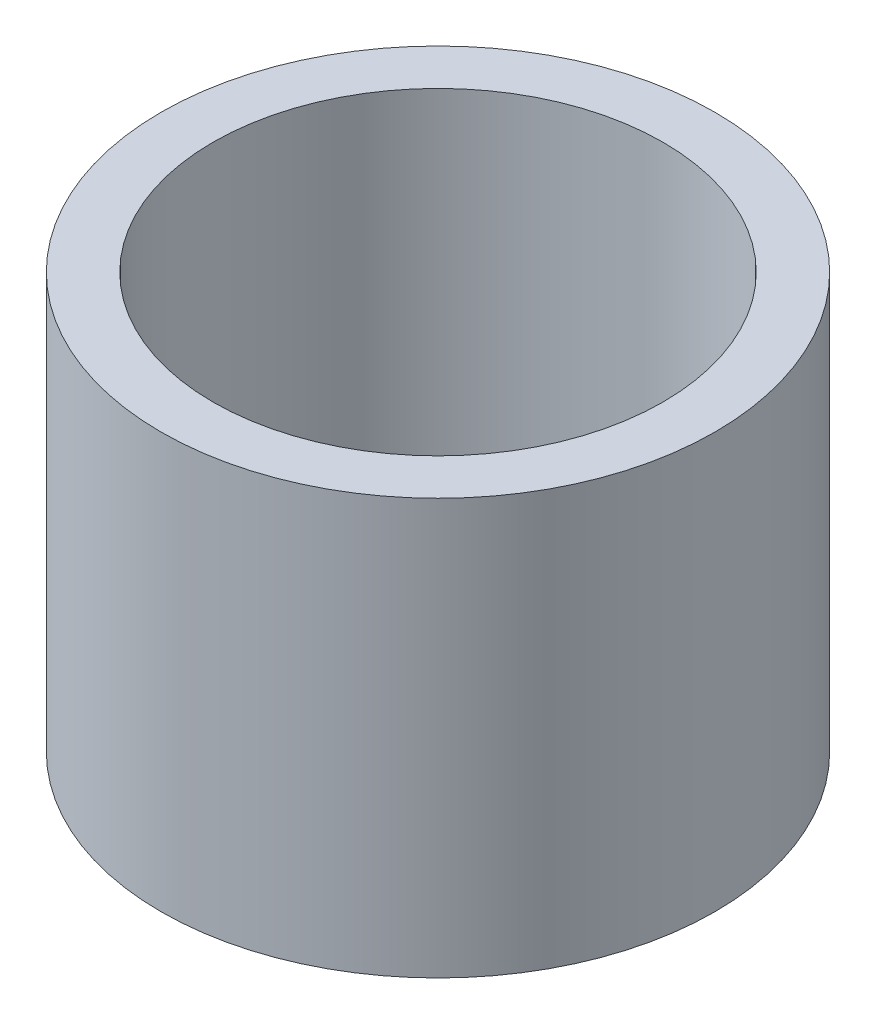
ISO-10303-21;
HEADER;
FILE_DESCRIPTION(('STEP AP214'),'2;1');
FILE_NAME('part.step','',(''),(''),'','','');
FILE_SCHEMA(('AUTOMOTIVE_DESIGN { 1 0 10303 214 1 1 1 1 }'));
ENDSEC;
DATA;
#1=APPLICATION_CONTEXT('core data for automotive mechanical design processes');
#2=APPLICATION_PROTOCOL_DEFINITION('international standard','automotive_design',2000,#1);
#3=PRODUCT_CONTEXT('',#1,'mechanical');
#4=PRODUCT('Part','Part','',(#3));
#5=PRODUCT_RELATED_PRODUCT_CATEGORY('part','',(#4));
#6=PRODUCT_DEFINITION_FORMATION('','',#4);
#7=PRODUCT_DEFINITION_CONTEXT('part definition',#1,'design');
#8=PRODUCT_DEFINITION('design','',#6,#7);
#9=PRODUCT_DEFINITION_SHAPE('','',#8);
#10=(LENGTH_UNIT() NAMED_UNIT(*) SI_UNIT(.MILLI.,.METRE.));
#11=(NAMED_UNIT(*) PLANE_ANGLE_UNIT() SI_UNIT($,.RADIAN.));
#12=(NAMED_UNIT(*) SI_UNIT($,.STERADIAN.) SOLID_ANGLE_UNIT());
#13=UNCERTAINTY_MEASURE_WITH_UNIT(LENGTH_MEASURE(1.E-05),#10,'distance_accuracy_value','');
#14=(GEOMETRIC_REPRESENTATION_CONTEXT(3) GLOBAL_UNCERTAINTY_ASSIGNED_CONTEXT((#13)) GLOBAL_UNIT_ASSIGNED_CONTEXT((#10,
#11,#12)) REPRESENTATION_CONTEXT('',''));
#15=CARTESIAN_POINT('',(0.,0.,0.));
#16=DIRECTION('',(0.,0.,1.));
#17=DIRECTION('',(1.,0.,0.));
#18=AXIS2_PLACEMENT_3D('',#15,#16,#17);
#19=CARTESIAN_POINT('',(0.,19.05,0.));
#20=DIRECTION('',(0.,1.,0.));
#21=DIRECTION('',(0.,0.,1.));
#22=AXIS2_PLACEMENT_3D('',#19,#20,#21);
#23=PLANE('',#22);
#24=CARTESIAN_POINT('',(0.,19.05,0.));
#25=DIRECTION('',(0.,1.,0.));
#26=DIRECTION('',(0.,0.,1.));
#27=AXIS2_PLACEMENT_3D('',#24,#25,#26);
#28=CIRCLE('',#27,12.7);
#29=CARTESIAN_POINT('',(0.,19.05,-12.7));
#30=VERTEX_POINT('',#29);
#31=EDGE_CURVE('E10',#30,#30,#28,.T.);
#32=ORIENTED_EDGE('',*,*,#31,.T.);
#33=EDGE_LOOP('',(#32));
#34=FACE_BOUND('',#33,.T.);
#35=CARTESIAN_POINT('',(0.,19.05,0.));
#36=DIRECTION('',(0.,1.,0.));
#37=DIRECTION('',(0.,0.,1.));
#38=AXIS2_PLACEMENT_3D('',#35,#36,#37);
#39=CIRCLE('',#38,10.31875);
#40=CARTESIAN_POINT('',(0.,19.05,-10.31875));
#41=VERTEX_POINT('',#40);
#42=EDGE_CURVE('E45',#41,#41,#39,.T.);
#43=ORIENTED_EDGE('',*,*,#42,.F.);
#44=EDGE_LOOP('',(#43));
#45=FACE_BOUND('',#44,.T.);
#46=ADVANCED_FACE('F34',(#34,#45),#23,.T.);
#47=CARTESIAN_POINT('',(0.,0.,0.));
#48=DIRECTION('',(0.,1.,0.));
#49=DIRECTION('',(0.,0.,1.));
#50=AXIS2_PLACEMENT_3D('',#47,#48,#49);
#51=PLANE('',#50);
#52=CARTESIAN_POINT('',(0.,0.,0.));
#53=DIRECTION('',(0.,1.,0.));
#54=DIRECTION('',(0.,0.,1.));
#55=AXIS2_PLACEMENT_3D('',#52,#53,#54);
#56=CIRCLE('',#55,12.7);
#57=CARTESIAN_POINT('',(0.,0.,-12.7));
#58=VERTEX_POINT('',#57);
#59=EDGE_CURVE('E38',#58,#58,#56,.T.);
#60=ORIENTED_EDGE('',*,*,#59,.F.);
#61=EDGE_LOOP('',(#60));
#62=FACE_BOUND('',#61,.T.);
#63=CARTESIAN_POINT('',(0.,0.,0.));
#64=DIRECTION('',(0.,1.,0.));
#65=DIRECTION('',(0.,0.,1.));
#66=AXIS2_PLACEMENT_3D('',#63,#64,#65);
#67=CIRCLE('',#66,10.31875);
#68=CARTESIAN_POINT('',(0.,0.,-10.31875));
#69=VERTEX_POINT('',#68);
#70=EDGE_CURVE('E47',#69,#69,#67,.T.);
#71=ORIENTED_EDGE('',*,*,#70,.T.);
#72=EDGE_LOOP('',(#71));
#73=FACE_BOUND('',#72,.T.);
#74=ADVANCED_FACE('F57',(#62,#73),#51,.F.);
#75=CARTESIAN_POINT('',(0.,19.05,0.));
#76=DIRECTION('',(0.,-1.,0.));
#77=DIRECTION('',(0.,0.,-1.));
#78=AXIS2_PLACEMENT_3D('',#75,#76,#77);
#79=CYLINDRICAL_SURFACE('',#78,12.7);
#80=CARTESIAN_POINT('',(0.,19.05,-12.7));
#81=CARTESIAN_POINT('',(0.,18.8515625,-12.7));
#82=CARTESIAN_POINT('',(0.,18.653125,-12.7));
#83=CARTESIAN_POINT('',(0.,18.25625,-12.7));
#84=CARTESIAN_POINT('',(0.,18.0578125,-12.7));
#85=CARTESIAN_POINT('',(0.,17.6609375,-12.7));
#86=CARTESIAN_POINT('',(0.,17.4625,-12.7));
#87=CARTESIAN_POINT('',(0.,17.065625,-12.7));
#88=CARTESIAN_POINT('',(0.,16.8671875,-12.7));
#89=CARTESIAN_POINT('',(0.,16.4703125,-12.7));
#90=CARTESIAN_POINT('',(0.,16.271875,-12.7));
#91=CARTESIAN_POINT('',(0.,15.875,-12.7));
#92=CARTESIAN_POINT('',(0.,15.6765625,-12.7));
#93=CARTESIAN_POINT('',(0.,15.2796875,-12.7));
#94=CARTESIAN_POINT('',(0.,15.08125,-12.7));
#95=CARTESIAN_POINT('',(0.,14.684375,-12.7));
#96=CARTESIAN_POINT('',(0.,14.4859375,-12.7));
#97=CARTESIAN_POINT('',(0.,14.0890625,-12.7));
#98=CARTESIAN_POINT('',(0.,13.890625,-12.7));
#99=CARTESIAN_POINT('',(0.,13.49375,-12.7));
#100=CARTESIAN_POINT('',(0.,13.2953125,-12.7));
#101=CARTESIAN_POINT('',(0.,12.8984375,-12.7));
#102=CARTESIAN_POINT('',(0.,12.7,-12.7));
#103=CARTESIAN_POINT('',(0.,12.303125,-12.7));
#104=CARTESIAN_POINT('',(0.,12.1046875,-12.7));
#105=CARTESIAN_POINT('',(0.,11.7078125,-12.7));
#106=CARTESIAN_POINT('',(0.,11.509375,-12.7));
#107=CARTESIAN_POINT('',(0.,11.1125,-12.7));
#108=CARTESIAN_POINT('',(0.,10.9140625,-12.7));
#109=CARTESIAN_POINT('',(0.,10.5171875,-12.7));
#110=CARTESIAN_POINT('',(0.,10.31875,-12.7));
#111=CARTESIAN_POINT('',(0.,9.921875,-12.7));
#112=CARTESIAN_POINT('',(0.,9.7234375,-12.7));
#113=CARTESIAN_POINT('',(0.,9.3265625,-12.7));
#114=CARTESIAN_POINT('',(0.,9.128125,-12.7));
#115=CARTESIAN_POINT('',(0.,8.73125,-12.7));
#116=CARTESIAN_POINT('',(0.,8.5328125,-12.7));
#117=CARTESIAN_POINT('',(0.,8.1359375,-12.7));
#118=CARTESIAN_POINT('',(0.,7.9375,-12.7));
#119=CARTESIAN_POINT('',(0.,7.540625,-12.7));
#120=CARTESIAN_POINT('',(0.,7.3421875,-12.7));
#121=CARTESIAN_POINT('',(0.,6.9453125,-12.7));
#122=CARTESIAN_POINT('',(0.,6.746875,-12.7));
#123=CARTESIAN_POINT('',(0.,6.35,-12.7));
#124=CARTESIAN_POINT('',(0.,6.1515625,-12.7));
#125=CARTESIAN_POINT('',(0.,5.7546875,-12.7));
#126=CARTESIAN_POINT('',(0.,5.55625,-12.7));
#127=CARTESIAN_POINT('',(0.,5.159375,-12.7));
#128=CARTESIAN_POINT('',(0.,4.9609375,-12.7));
#129=CARTESIAN_POINT('',(0.,4.5640625,-12.7));
#130=CARTESIAN_POINT('',(0.,4.365625,-12.7));
#131=CARTESIAN_POINT('',(0.,3.96875,-12.7));
#132=CARTESIAN_POINT('',(0.,3.7703125,-12.7));
#133=CARTESIAN_POINT('',(0.,3.3734375,-12.7));
#134=CARTESIAN_POINT('',(0.,3.175,-12.7));
#135=CARTESIAN_POINT('',(0.,2.778125,-12.7));
#136=CARTESIAN_POINT('',(0.,2.5796875,-12.7));
#137=CARTESIAN_POINT('',(0.,2.1828125,-12.7));
#138=CARTESIAN_POINT('',(0.,1.984375,-12.7));
#139=CARTESIAN_POINT('',(0.,1.5875,-12.7));
#140=CARTESIAN_POINT('',(0.,1.3890625,-12.7));
#141=CARTESIAN_POINT('',(0.,0.992187500000001,-12.7));
#142=CARTESIAN_POINT('',(0.,0.793750000000001,-12.7));
#143=CARTESIAN_POINT('',(0.,0.396875,-12.7));
#144=CARTESIAN_POINT('',(0.,0.1984375,-12.7));
#145=CARTESIAN_POINT('',(0.,0.,-12.7));
#146=B_SPLINE_CURVE_WITH_KNOTS('',3,(#80,#81,#82,#83,#84,#85,#86,#87,#88,#89,#90,#91,#92,#93,
#94,#95,#96,#97,#98,#99,#100,#101,#102,#103,#104,#105,#106,#107,#108,#109,#110,#111,#112,#113,
#114,#115,#116,#117,#118,#119,#120,#121,#122,#123,#124,#125,#126,#127,#128,#129,#130,#131,#132,
#133,#134,#135,#136,#137,#138,#139,#140,#141,#142,#143,#144,#145),.UNSPECIFIED.,.F.,.F.,(4,2,2,
2,2,2,2,2,2,2,2,2,2,2,2,2,2,2,2,2,2,2,2,2,2,2,2,2,2,2,2,2,4),(0.,0.595312499999997,1.190625,
1.7859375,2.38125,2.9765625,3.571875,4.1671875,4.7625,5.3578125,5.953125,6.5484375,7.14375,
7.7390625,8.334375,8.9296875,9.525,10.1203125,10.715625,11.3109375,11.90625,12.5015625,
13.096875,13.6921875,14.2875,14.8828125,15.478125,16.0734375,16.66875,17.2640625,17.859375,
18.4546875,19.05),.UNSPECIFIED.);
#147=EDGE_CURVE('BSEAM36',#30,#58,#146,.T.);
#148=ORIENTED_EDGE('',*,*,#31,.F.);
#149=ORIENTED_EDGE('',*,*,#59,.T.);
#150=ORIENTED_EDGE('',*,*,#147,.T.);
#151=ORIENTED_EDGE('',*,*,#147,.F.);
#152=EDGE_LOOP('',(#148,#150,#149,#151));
#153=FACE_BOUND('',#152,.T.);
#154=ADVANCED_FACE('F36',(#153),#79,.T.);
#155=CARTESIAN_POINT('',(0.,19.05,0.));
#156=DIRECTION('',(0.,-1.,0.));
#157=DIRECTION('',(0.,0.,-1.));
#158=AXIS2_PLACEMENT_3D('',#155,#156,#157);
#159=CYLINDRICAL_SURFACE('',#158,10.31875);
#160=CARTESIAN_POINT('',(0.,19.05,-10.31875));
#161=CARTESIAN_POINT('',(0.,18.8515625,-10.31875));
#162=CARTESIAN_POINT('',(0.,18.653125,-10.31875));
#163=CARTESIAN_POINT('',(0.,18.25625,-10.31875));
#164=CARTESIAN_POINT('',(0.,18.0578125,-10.31875));
#165=CARTESIAN_POINT('',(0.,17.6609375,-10.31875));
#166=CARTESIAN_POINT('',(0.,17.4625,-10.31875));
#167=CARTESIAN_POINT('',(0.,17.065625,-10.31875));
#168=CARTESIAN_POINT('',(0.,16.8671875,-10.31875));
#169=CARTESIAN_POINT('',(0.,16.4703125,-10.31875));
#170=CARTESIAN_POINT('',(0.,16.271875,-10.31875));
#171=CARTESIAN_POINT('',(0.,15.875,-10.31875));
#172=CARTESIAN_POINT('',(0.,15.6765625,-10.31875));
#173=CARTESIAN_POINT('',(0.,15.2796875,-10.31875));
#174=CARTESIAN_POINT('',(0.,15.08125,-10.31875));
#175=CARTESIAN_POINT('',(0.,14.684375,-10.31875));
#176=CARTESIAN_POINT('',(0.,14.4859375,-10.31875));
#177=CARTESIAN_POINT('',(0.,14.0890625,-10.31875));
#178=CARTESIAN_POINT('',(0.,13.890625,-10.31875));
#179=CARTESIAN_POINT('',(0.,13.49375,-10.31875));
#180=CARTESIAN_POINT('',(0.,13.2953125,-10.31875));
#181=CARTESIAN_POINT('',(0.,12.8984375,-10.31875));
#182=CARTESIAN_POINT('',(0.,12.7,-10.31875));
#183=CARTESIAN_POINT('',(0.,12.303125,-10.31875));
#184=CARTESIAN_POINT('',(0.,12.1046875,-10.31875));
#185=CARTESIAN_POINT('',(0.,11.7078125,-10.31875));
#186=CARTESIAN_POINT('',(0.,11.509375,-10.31875));
#187=CARTESIAN_POINT('',(0.,11.1125,-10.31875));
#188=CARTESIAN_POINT('',(0.,10.9140625,-10.31875));
#189=CARTESIAN_POINT('',(0.,10.5171875,-10.31875));
#190=CARTESIAN_POINT('',(0.,10.31875,-10.31875));
#191=CARTESIAN_POINT('',(0.,9.921875,-10.31875));
#192=CARTESIAN_POINT('',(0.,9.7234375,-10.31875));
#193=CARTESIAN_POINT('',(0.,9.3265625,-10.31875));
#194=CARTESIAN_POINT('',(0.,9.128125,-10.31875));
#195=CARTESIAN_POINT('',(0.,8.73125,-10.31875));
#196=CARTESIAN_POINT('',(0.,8.5328125,-10.31875));
#197=CARTESIAN_POINT('',(0.,8.1359375,-10.31875));
#198=CARTESIAN_POINT('',(0.,7.9375,-10.31875));
#199=CARTESIAN_POINT('',(0.,7.540625,-10.31875));
#200=CARTESIAN_POINT('',(0.,7.3421875,-10.31875));
#201=CARTESIAN_POINT('',(0.,6.9453125,-10.31875));
#202=CARTESIAN_POINT('',(0.,6.746875,-10.31875));
#203=CARTESIAN_POINT('',(0.,6.35,-10.31875));
#204=CARTESIAN_POINT('',(0.,6.1515625,-10.31875));
#205=CARTESIAN_POINT('',(0.,5.7546875,-10.31875));
#206=CARTESIAN_POINT('',(0.,5.55625,-10.31875));
#207=CARTESIAN_POINT('',(0.,5.159375,-10.31875));
#208=CARTESIAN_POINT('',(0.,4.9609375,-10.31875));
#209=CARTESIAN_POINT('',(0.,4.5640625,-10.31875));
#210=CARTESIAN_POINT('',(0.,4.365625,-10.31875));
#211=CARTESIAN_POINT('',(0.,3.96875,-10.31875));
#212=CARTESIAN_POINT('',(0.,3.7703125,-10.31875));
#213=CARTESIAN_POINT('',(0.,3.3734375,-10.31875));
#214=CARTESIAN_POINT('',(0.,3.175,-10.31875));
#215=CARTESIAN_POINT('',(0.,2.778125,-10.31875));
#216=CARTESIAN_POINT('',(0.,2.5796875,-10.31875));
#217=CARTESIAN_POINT('',(0.,2.1828125,-10.31875));
#218=CARTESIAN_POINT('',(0.,1.984375,-10.31875));
#219=CARTESIAN_POINT('',(0.,1.5875,-10.31875));
#220=CARTESIAN_POINT('',(0.,1.3890625,-10.31875));
#221=CARTESIAN_POINT('',(0.,0.992187500000001,-10.31875));
#222=CARTESIAN_POINT('',(0.,0.793750000000001,-10.31875));
#223=CARTESIAN_POINT('',(0.,0.396875,-10.31875));
#224=CARTESIAN_POINT('',(0.,0.1984375,-10.31875));
#225=CARTESIAN_POINT('',(0.,0.,-10.31875));
#226=B_SPLINE_CURVE_WITH_KNOTS('',3,(#160,#161,#162,#163,#164,#165,#166,#167,#168,#169,#170,
#171,#172,#173,#174,#175,#176,#177,#178,#179,#180,#181,#182,#183,#184,#185,#186,#187,#188,#189,
#190,#191,#192,#193,#194,#195,#196,#197,#198,#199,#200,#201,#202,#203,#204,#205,#206,#207,#208,
#209,#210,#211,#212,#213,#214,#215,#216,#217,#218,#219,#220,#221,#222,#223,#224,#225),
.UNSPECIFIED.,.F.,.F.,(4,2,2,2,2,2,2,2,2,2,2,2,2,2,2,2,2,2,2,2,2,2,2,2,2,2,2,2,2,2,2,2,4),(0.,
0.595312499999997,1.190625,1.7859375,2.38125,2.9765625,3.571875,4.1671875,4.7625,5.3578125,
5.953125,6.5484375,7.14375,7.7390625,8.334375,8.9296875,9.525,10.1203125,10.715625,11.3109375,
11.90625,12.5015625,13.096875,13.6921875,14.2875,14.8828125,15.478125,16.0734375,16.66875,
17.2640625,17.859375,18.4546875,19.05),.UNSPECIFIED.);
#227=EDGE_CURVE('BSEAM53',#41,#69,#226,.T.);
#228=ORIENTED_EDGE('',*,*,#42,.T.);
#229=ORIENTED_EDGE('',*,*,#70,.F.);
#230=ORIENTED_EDGE('',*,*,#227,.T.);
#231=ORIENTED_EDGE('',*,*,#227,.F.);
#232=EDGE_LOOP('',(#228,#230,#229,#231));
#233=FACE_BOUND('',#232,.T.);
#234=ADVANCED_FACE('F53',(#233),#159,.F.);
#235=CLOSED_SHELL('',(#46,#74,#154,#234));
#236=MANIFOLD_SOLID_BREP('B2',#235);
#237=ADVANCED_BREP_SHAPE_REPRESENTATION('',(#18,#236),#14);
#238=SHAPE_DEFINITION_REPRESENTATION(#9,#237);
ENDSEC;
END-ISO-10303-21;
